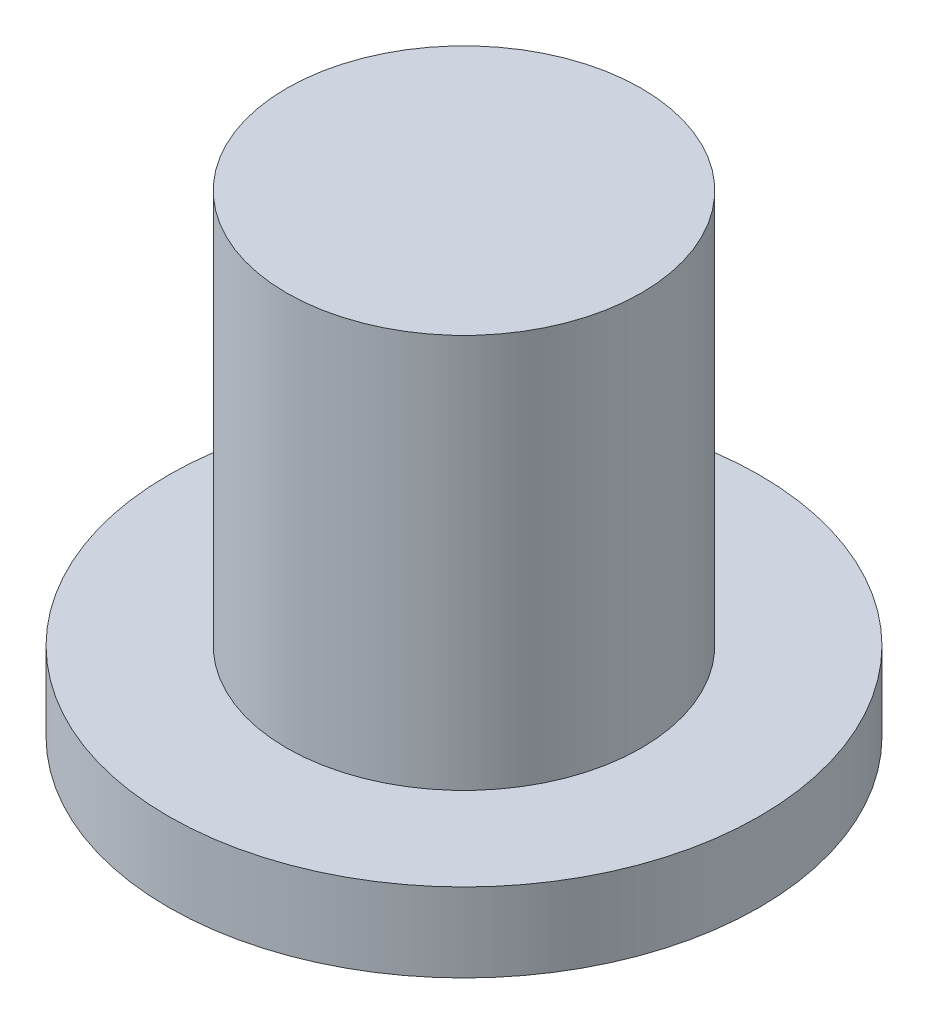
ISO-10303-21;
HEADER;
FILE_DESCRIPTION(('STEP AP214'),'2;1');
FILE_NAME('part.step','',(''),(''),'','','');
FILE_SCHEMA(('AUTOMOTIVE_DESIGN { 1 0 10303 214 1 1 1 1 }'));
ENDSEC;
DATA;
#1=APPLICATION_CONTEXT('core data for automotive mechanical design processes');
#2=APPLICATION_PROTOCOL_DEFINITION('international standard','automotive_design',2000,#1);
#3=PRODUCT_CONTEXT('',#1,'mechanical');
#4=PRODUCT('Part','Part','',(#3));
#5=PRODUCT_RELATED_PRODUCT_CATEGORY('part','',(#4));
#6=PRODUCT_DEFINITION_FORMATION('','',#4);
#7=PRODUCT_DEFINITION_CONTEXT('part definition',#1,'design');
#8=PRODUCT_DEFINITION('design','',#6,#7);
#9=PRODUCT_DEFINITION_SHAPE('','',#8);
#10=(LENGTH_UNIT() NAMED_UNIT(*) SI_UNIT(.MILLI.,.METRE.));
#11=(NAMED_UNIT(*) PLANE_ANGLE_UNIT() SI_UNIT($,.RADIAN.));
#12=(NAMED_UNIT(*) SI_UNIT($,.STERADIAN.) SOLID_ANGLE_UNIT());
#13=UNCERTAINTY_MEASURE_WITH_UNIT(LENGTH_MEASURE(1.E-05),#10,'distance_accuracy_value','');
#14=(GEOMETRIC_REPRESENTATION_CONTEXT(3) GLOBAL_UNCERTAINTY_ASSIGNED_CONTEXT((#13)) GLOBAL_UNIT_ASSIGNED_CONTEXT((#10,
#11,#12)) REPRESENTATION_CONTEXT('',''));
#15=CARTESIAN_POINT('',(0.,0.,0.));
#16=DIRECTION('',(0.,0.,1.));
#17=DIRECTION('',(1.,0.,0.));
#18=AXIS2_PLACEMENT_3D('',#15,#16,#17);
#19=CARTESIAN_POINT('',(0.,0.508,0.));
#20=DIRECTION('',(0.,-1.,0.));
#21=DIRECTION('',(0.,0.,-1.));
#22=AXIS2_PLACEMENT_3D('',#19,#20,#21);
#23=CYLINDRICAL_SURFACE('',#22,1.905);
#24=CARTESIAN_POINT('',(0.,0.508,0.));
#25=DIRECTION('',(0.,1.,0.));
#26=DIRECTION('',(0.,0.,1.));
#27=AXIS2_PLACEMENT_3D('',#24,#25,#26);
#28=CIRCLE('',#27,1.905);
#29=CARTESIAN_POINT('',(0.,0.508,1.905));
#30=VERTEX_POINT('',#29);
#31=EDGE_CURVE('E45',#30,#30,#28,.T.);
#32=ORIENTED_EDGE('',*,*,#31,.F.);
#33=EDGE_LOOP('',(#32));
#34=FACE_BOUND('',#33,.T.);
#35=CARTESIAN_POINT('',(0.,0.,0.));
#36=DIRECTION('',(0.,1.,0.));
#37=DIRECTION('',(0.,0.,1.));
#38=AXIS2_PLACEMENT_3D('',#35,#36,#37);
#39=CIRCLE('',#38,1.905);
#40=CARTESIAN_POINT('',(0.,0.,1.905));
#41=VERTEX_POINT('',#40);
#42=EDGE_CURVE('E40',#41,#41,#39,.T.);
#43=ORIENTED_EDGE('',*,*,#42,.T.);
#44=EDGE_LOOP('',(#43));
#45=FACE_BOUND('',#44,.T.);
#46=ADVANCED_FACE('F37',(#34,#45),#23,.T.);
#47=CARTESIAN_POINT('',(0.,0.508,0.));
#48=DIRECTION('',(0.,1.,0.));
#49=DIRECTION('',(0.,0.,1.));
#50=AXIS2_PLACEMENT_3D('',#47,#48,#49);
#51=PLANE('',#50);
#52=CARTESIAN_POINT('',(0.,0.508,0.));
#53=DIRECTION('',(0.,1.,0.));
#54=DIRECTION('',(0.,0.,1.));
#55=AXIS2_PLACEMENT_3D('',#52,#53,#54);
#56=CIRCLE('',#55,1.143);
#57=CARTESIAN_POINT('',(0.,0.508,1.143));
#58=VERTEX_POINT('',#57);
#59=EDGE_CURVE('E10',#58,#58,#56,.T.);
#60=ORIENTED_EDGE('',*,*,#59,.F.);
#61=EDGE_LOOP('',(#60));
#62=FACE_BOUND('',#61,.T.);
#63=ORIENTED_EDGE('',*,*,#31,.T.);
#64=EDGE_LOOP('',(#63));
#65=FACE_BOUND('',#64,.T.);
#66=ADVANCED_FACE('F65',(#62,#65),#51,.T.);
#67=CARTESIAN_POINT('',(0.,0.,0.));
#68=DIRECTION('',(0.,1.,0.));
#69=DIRECTION('',(0.,0.,1.));
#70=AXIS2_PLACEMENT_3D('',#67,#68,#69);
#71=PLANE('',#70);
#72=ORIENTED_EDGE('',*,*,#42,.F.);
#73=EDGE_LOOP('',(#72));
#74=FACE_BOUND('',#73,.T.);
#75=ADVANCED_FACE('F62',(#74),#71,.F.);
#76=CARTESIAN_POINT('',(0.,3.048,0.));
#77=DIRECTION('',(0.,-1.,0.));
#78=DIRECTION('',(0.,0.,-1.));
#79=AXIS2_PLACEMENT_3D('',#76,#77,#78);
#80=CYLINDRICAL_SURFACE('',#79,1.143);
#81=CARTESIAN_POINT('',(0.,3.048,0.));
#82=DIRECTION('',(0.,1.,0.));
#83=DIRECTION('',(0.,0.,1.));
#84=AXIS2_PLACEMENT_3D('',#81,#82,#83);
#85=CIRCLE('',#84,1.143);
#86=CARTESIAN_POINT('',(0.,3.048,1.143));
#87=VERTEX_POINT('',#86);
#88=EDGE_CURVE('E52',#87,#87,#85,.T.);
#89=ORIENTED_EDGE('',*,*,#88,.F.);
#90=EDGE_LOOP('',(#89));
#91=FACE_BOUND('',#90,.T.);
#92=ORIENTED_EDGE('',*,*,#59,.T.);
#93=EDGE_LOOP('',(#92));
#94=FACE_BOUND('',#93,.T.);
#95=ADVANCED_FACE('F64',(#91,#94),#80,.T.);
#96=CARTESIAN_POINT('',(0.,3.048,0.));
#97=DIRECTION('',(0.,1.,0.));
#98=DIRECTION('',(0.,0.,1.));
#99=AXIS2_PLACEMENT_3D('',#96,#97,#98);
#100=PLANE('',#99);
#101=ORIENTED_EDGE('',*,*,#88,.T.);
#102=EDGE_LOOP('',(#101));
#103=FACE_BOUND('',#102,.T.);
#104=ADVANCED_FACE('F70',(#103),#100,.T.);
#105=CLOSED_SHELL('',(#46,#66,#75,#95,#104));
#106=MANIFOLD_SOLID_BREP('B2',#105);
#107=ADVANCED_BREP_SHAPE_REPRESENTATION('',(#18,#106),#14);
#108=SHAPE_DEFINITION_REPRESENTATION(#9,#107);
ENDSEC;
END-ISO-10303-21;
